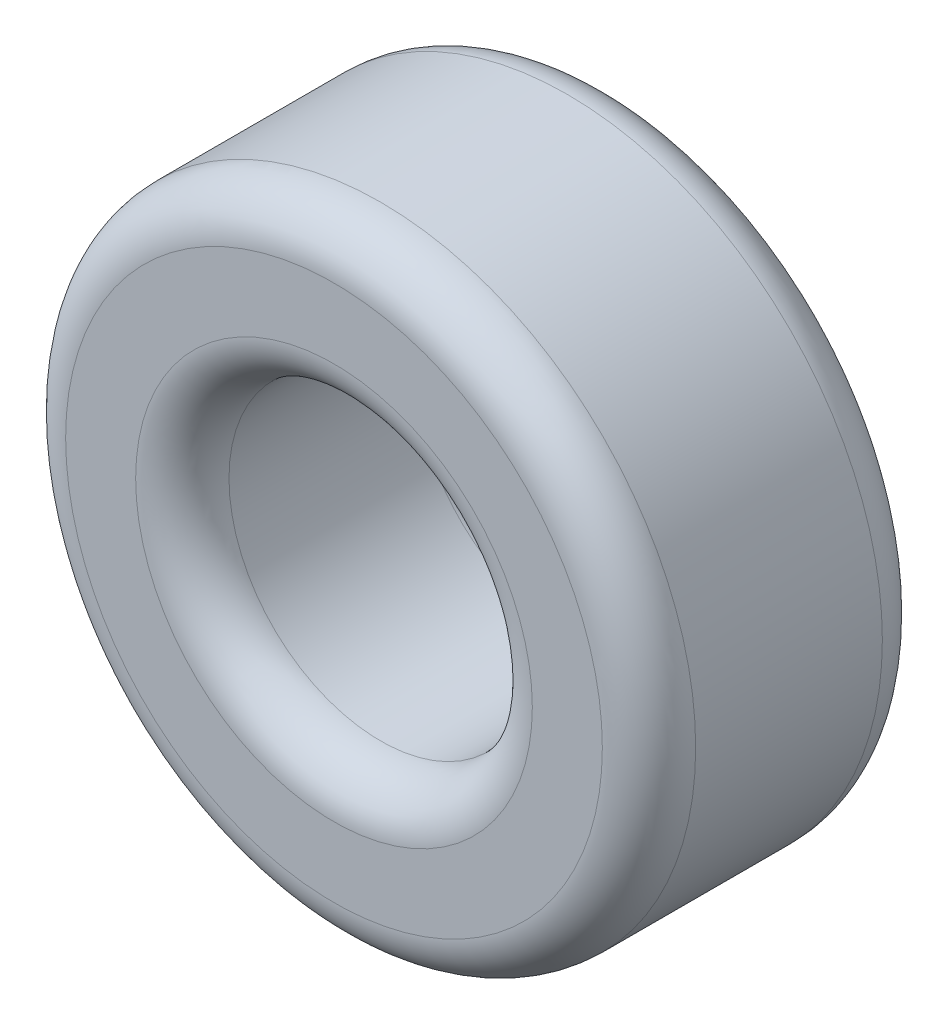
ISO-10303-21;
HEADER;
FILE_DESCRIPTION(('STEP AP214'),'2;1');
FILE_NAME('part.step','',(''),(''),'','','');
FILE_SCHEMA(('AUTOMOTIVE_DESIGN { 1 0 10303 214 1 1 1 1 }'));
ENDSEC;
DATA;
#1=APPLICATION_CONTEXT('core data for automotive mechanical design processes');
#2=APPLICATION_PROTOCOL_DEFINITION('international standard','automotive_design',2000,#1);
#3=PRODUCT_CONTEXT('',#1,'mechanical');
#4=PRODUCT('Part','Part','',(#3));
#5=PRODUCT_RELATED_PRODUCT_CATEGORY('part','',(#4));
#6=PRODUCT_DEFINITION_FORMATION('','',#4);
#7=PRODUCT_DEFINITION_CONTEXT('part definition',#1,'design');
#8=PRODUCT_DEFINITION('design','',#6,#7);
#9=PRODUCT_DEFINITION_SHAPE('','',#8);
#10=(LENGTH_UNIT() NAMED_UNIT(*) SI_UNIT(.MILLI.,.METRE.));
#11=(NAMED_UNIT(*) PLANE_ANGLE_UNIT() SI_UNIT($,.RADIAN.));
#12=(NAMED_UNIT(*) SI_UNIT($,.STERADIAN.) SOLID_ANGLE_UNIT());
#13=UNCERTAINTY_MEASURE_WITH_UNIT(LENGTH_MEASURE(1.E-05),#10,'distance_accuracy_value','');
#14=(GEOMETRIC_REPRESENTATION_CONTEXT(3) GLOBAL_UNCERTAINTY_ASSIGNED_CONTEXT((#13)) GLOBAL_UNIT_ASSIGNED_CONTEXT((#10,
#11,#12)) REPRESENTATION_CONTEXT('',''));
#15=CARTESIAN_POINT('',(0.,0.,0.));
#16=DIRECTION('',(0.,0.,1.));
#17=DIRECTION('',(1.,0.,0.));
#18=AXIS2_PLACEMENT_3D('',#15,#16,#17);
#19=CARTESIAN_POINT('',(0.,0.,24.));
#20=DIRECTION('',(0.,0.,1.));
#21=DIRECTION('',(1.,0.,0.));
#22=AXIS2_PLACEMENT_3D('',#19,#20,#21);
#23=PLANE('',#22);
#24=CARTESIAN_POINT('',(0.,0.,24.));
#25=DIRECTION('',(0.,0.,1.));
#26=DIRECTION('',(1.,0.,0.));
#27=AXIS2_PLACEMENT_3D('',#24,#25,#26);
#28=CIRCLE('',#27,17.);
#29=CARTESIAN_POINT('',(17.,0.,24.));
#30=VERTEX_POINT('',#29);
#31=EDGE_CURVE('E47',#30,#30,#28,.F.);
#32=ORIENTED_EDGE('',*,*,#31,.T.);
#33=EDGE_LOOP('',(#32));
#34=FACE_BOUND('',#33,.T.);
#35=CARTESIAN_POINT('',(0.,0.,24.));
#36=DIRECTION('',(0.,0.,1.));
#37=DIRECTION('',(1.,0.,0.));
#38=AXIS2_PLACEMENT_3D('',#35,#36,#37);
#39=CIRCLE('',#38,23.);
#40=CARTESIAN_POINT('',(23.,0.,24.));
#41=VERTEX_POINT('',#40);
#42=EDGE_CURVE('E50',#41,#41,#39,.T.);
#43=ORIENTED_EDGE('',*,*,#42,.T.);
#44=EDGE_LOOP('',(#43));
#45=FACE_BOUND('',#44,.T.);
#46=ADVANCED_FACE('F27',(#34,#45),#23,.T.);
#47=CARTESIAN_POINT('',(0.,0.,0.));
#48=DIRECTION('',(0.,0.,1.));
#49=DIRECTION('',(1.,0.,0.));
#50=AXIS2_PLACEMENT_3D('',#47,#48,#49);
#51=PLANE('',#50);
#52=CARTESIAN_POINT('',(0.,0.,0.));
#53=DIRECTION('',(0.,0.,1.));
#54=DIRECTION('',(1.,0.,0.));
#55=AXIS2_PLACEMENT_3D('',#52,#53,#54);
#56=CIRCLE('',#55,17.);
#57=CARTESIAN_POINT('',(17.,0.,0.));
#58=VERTEX_POINT('',#57);
#59=EDGE_CURVE('E38',#58,#58,#56,.T.);
#60=ORIENTED_EDGE('',*,*,#59,.T.);
#61=EDGE_LOOP('',(#60));
#62=FACE_BOUND('',#61,.T.);
#63=CARTESIAN_POINT('',(0.,0.,0.));
#64=DIRECTION('',(0.,0.,1.));
#65=DIRECTION('',(1.,0.,0.));
#66=AXIS2_PLACEMENT_3D('',#63,#64,#65);
#67=CIRCLE('',#66,23.);
#68=CARTESIAN_POINT('',(23.,0.,0.));
#69=VERTEX_POINT('',#68);
#70=EDGE_CURVE('E42',#69,#69,#67,.F.);
#71=ORIENTED_EDGE('',*,*,#70,.T.);
#72=EDGE_LOOP('',(#71));
#73=FACE_BOUND('',#72,.T.);
#74=ADVANCED_FACE('F70',(#62,#73),#51,.F.);
#75=CARTESIAN_POINT('',(0.,0.,24.));
#76=DIRECTION('',(0.,0.,-1.));
#77=DIRECTION('',(-1.,0.,0.));
#78=AXIS2_PLACEMENT_3D('',#75,#76,#77);
#79=CYLINDRICAL_SURFACE('',#78,27.);
#80=CARTESIAN_POINT('',(0.,0.,4.));
#81=DIRECTION('',(0.,0.,1.));
#82=DIRECTION('',(1.,0.,0.));
#83=AXIS2_PLACEMENT_3D('',#80,#81,#82);
#84=CIRCLE('',#83,27.);
#85=CARTESIAN_POINT('',(27.,0.,4.));
#86=VERTEX_POINT('',#85);
#87=EDGE_CURVE('E10',#86,#86,#84,.T.);
#88=ORIENTED_EDGE('',*,*,#87,.T.);
#89=EDGE_LOOP('',(#88));
#90=FACE_BOUND('',#89,.T.);
#91=CARTESIAN_POINT('',(0.,0.,20.));
#92=DIRECTION('',(0.,0.,1.));
#93=DIRECTION('',(1.,0.,0.));
#94=AXIS2_PLACEMENT_3D('',#91,#92,#93);
#95=CIRCLE('',#94,27.);
#96=CARTESIAN_POINT('',(27.,0.,20.));
#97=VERTEX_POINT('',#96);
#98=EDGE_CURVE('E34',#97,#97,#95,.F.);
#99=ORIENTED_EDGE('',*,*,#98,.T.);
#100=EDGE_LOOP('',(#99));
#101=FACE_BOUND('',#100,.T.);
#102=ADVANCED_FACE('F29',(#90,#101),#79,.T.);
#103=CARTESIAN_POINT('',(0.,0.,24.));
#104=DIRECTION('',(0.,0.,-1.));
#105=DIRECTION('',(-1.,0.,0.));
#106=AXIS2_PLACEMENT_3D('',#103,#104,#105);
#107=CYLINDRICAL_SURFACE('',#106,13.);
#108=CARTESIAN_POINT('',(0.,0.,20.));
#109=DIRECTION('',(0.,0.,1.));
#110=DIRECTION('',(1.,0.,0.));
#111=AXIS2_PLACEMENT_3D('',#108,#109,#110);
#112=CIRCLE('',#111,13.);
#113=CARTESIAN_POINT('',(13.,0.,20.));
#114=VERTEX_POINT('',#113);
#115=EDGE_CURVE('E53',#114,#114,#112,.T.);
#116=ORIENTED_EDGE('',*,*,#115,.T.);
#117=EDGE_LOOP('',(#116));
#118=FACE_BOUND('',#117,.T.);
#119=CARTESIAN_POINT('',(0.,0.,4.));
#120=DIRECTION('',(0.,0.,1.));
#121=DIRECTION('',(1.,0.,0.));
#122=AXIS2_PLACEMENT_3D('',#119,#120,#121);
#123=CIRCLE('',#122,13.);
#124=CARTESIAN_POINT('',(13.,0.,4.));
#125=VERTEX_POINT('',#124);
#126=EDGE_CURVE('E56',#125,#125,#123,.F.);
#127=ORIENTED_EDGE('',*,*,#126,.T.);
#128=EDGE_LOOP('',(#127));
#129=FACE_BOUND('',#128,.T.);
#130=ADVANCED_FACE('F60',(#118,#129),#107,.F.);
#131=CARTESIAN_POINT('',(0.,0.,20.));
#132=DIRECTION('',(0.,0.,1.));
#133=DIRECTION('',(1.,0.,0.));
#134=AXIS2_PLACEMENT_3D('',#131,#132,#133);
#135=TOROIDAL_SURFACE('',#134,17.,4.);
#136=ORIENTED_EDGE('',*,*,#31,.F.);
#137=EDGE_LOOP('',(#136));
#138=FACE_BOUND('',#137,.T.);
#139=ORIENTED_EDGE('',*,*,#115,.F.);
#140=EDGE_LOOP('',(#139));
#141=FACE_BOUND('',#140,.T.);
#142=ADVANCED_FACE('F66',(#138,#141),#135,.T.);
#143=CARTESIAN_POINT('',(0.,0.,4.));
#144=DIRECTION('',(0.,0.,1.));
#145=DIRECTION('',(1.,0.,0.));
#146=AXIS2_PLACEMENT_3D('',#143,#144,#145);
#147=TOROIDAL_SURFACE('',#146,17.,4.);
#148=ORIENTED_EDGE('',*,*,#126,.F.);
#149=EDGE_LOOP('',(#148));
#150=FACE_BOUND('',#149,.T.);
#151=ORIENTED_EDGE('',*,*,#59,.F.);
#152=EDGE_LOOP('',(#151));
#153=FACE_BOUND('',#152,.T.);
#154=ADVANCED_FACE('F62',(#150,#153),#147,.T.);
#155=CARTESIAN_POINT('',(0.,0.,4.));
#156=DIRECTION('',(0.,0.,1.));
#157=DIRECTION('',(1.,0.,0.));
#158=AXIS2_PLACEMENT_3D('',#155,#156,#157);
#159=TOROIDAL_SURFACE('',#158,23.,4.);
#160=ORIENTED_EDGE('',*,*,#70,.F.);
#161=EDGE_LOOP('',(#160));
#162=FACE_BOUND('',#161,.T.);
#163=ORIENTED_EDGE('',*,*,#87,.F.);
#164=EDGE_LOOP('',(#163));
#165=FACE_BOUND('',#164,.T.);
#166=ADVANCED_FACE('F65',(#162,#165),#159,.T.);
#167=CARTESIAN_POINT('',(0.,0.,20.));
#168=DIRECTION('',(0.,0.,1.));
#169=DIRECTION('',(1.,0.,0.));
#170=AXIS2_PLACEMENT_3D('',#167,#168,#169);
#171=TOROIDAL_SURFACE('',#170,23.,4.);
#172=ORIENTED_EDGE('',*,*,#98,.F.);
#173=EDGE_LOOP('',(#172));
#174=FACE_BOUND('',#173,.T.);
#175=ORIENTED_EDGE('',*,*,#42,.F.);
#176=EDGE_LOOP('',(#175));
#177=FACE_BOUND('',#176,.T.);
#178=ADVANCED_FACE('F78',(#174,#177),#171,.T.);
#179=CLOSED_SHELL('',(#46,#74,#102,#130,#142,#154,#166,#178));
#180=MANIFOLD_SOLID_BREP('B2',#179);
#181=ADVANCED_BREP_SHAPE_REPRESENTATION('',(#18,#180),#14);
#182=SHAPE_DEFINITION_REPRESENTATION(#9,#181);
ENDSEC;
END-ISO-10303-21;
